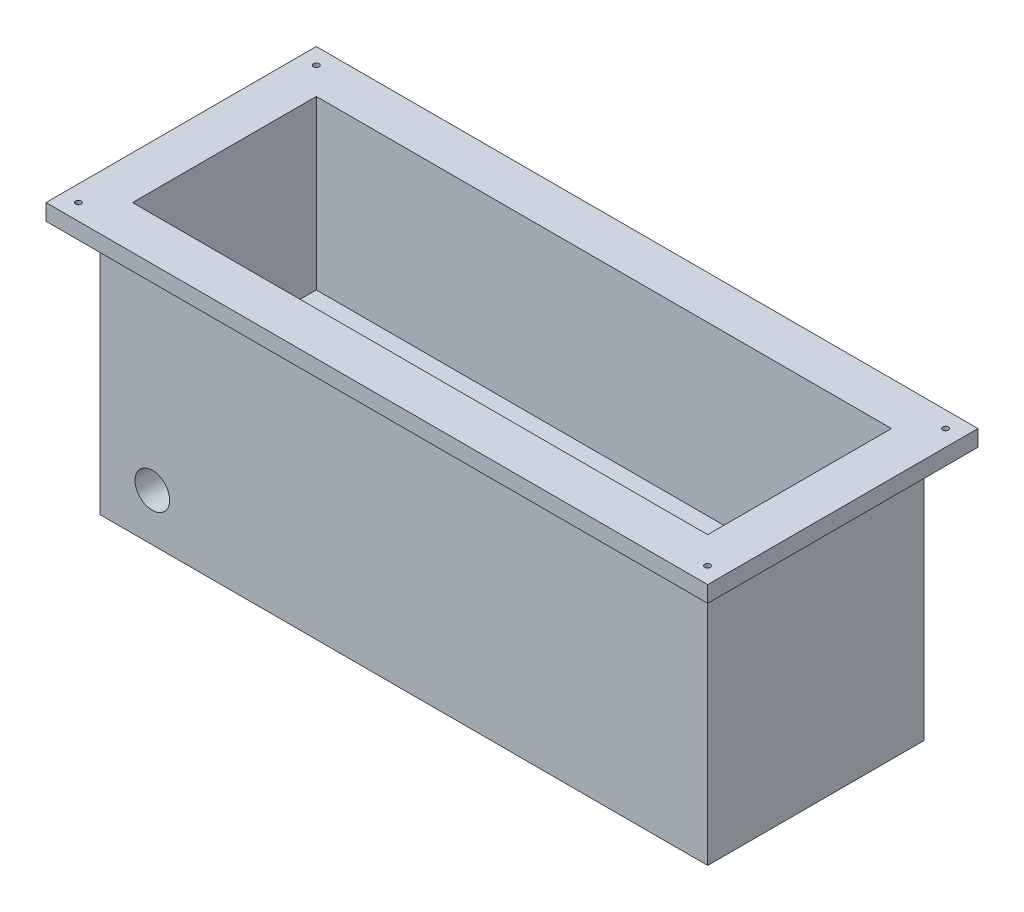
ISO-10303-21;
HEADER;
FILE_DESCRIPTION(('STEP AP214'),'2;1');
FILE_NAME('part.step','',(''),(''),'','','');
FILE_SCHEMA(('AUTOMOTIVE_DESIGN { 1 0 10303 214 1 1 1 1 }'));
ENDSEC;
DATA;
#1=APPLICATION_CONTEXT('core data for automotive mechanical design processes');
#2=APPLICATION_PROTOCOL_DEFINITION('international standard','automotive_design',2000,#1);
#3=PRODUCT_CONTEXT('',#1,'mechanical');
#4=PRODUCT('Part','Part','',(#3));
#5=PRODUCT_RELATED_PRODUCT_CATEGORY('part','',(#4));
#6=PRODUCT_DEFINITION_FORMATION('','',#4);
#7=PRODUCT_DEFINITION_CONTEXT('part definition',#1,'design');
#8=PRODUCT_DEFINITION('design','',#6,#7);
#9=PRODUCT_DEFINITION_SHAPE('','',#8);
#10=(LENGTH_UNIT() NAMED_UNIT(*) SI_UNIT(.MILLI.,.METRE.));
#11=(NAMED_UNIT(*) PLANE_ANGLE_UNIT() SI_UNIT($,.RADIAN.));
#12=(NAMED_UNIT(*) SI_UNIT($,.STERADIAN.) SOLID_ANGLE_UNIT());
#13=UNCERTAINTY_MEASURE_WITH_UNIT(LENGTH_MEASURE(1.E-05),#10,'distance_accuracy_value','');
#14=(GEOMETRIC_REPRESENTATION_CONTEXT(3) GLOBAL_UNCERTAINTY_ASSIGNED_CONTEXT((#13)) GLOBAL_UNIT_ASSIGNED_CONTEXT((#10,
#11,#12)) REPRESENTATION_CONTEXT('',''));
#15=CARTESIAN_POINT('',(0.,0.,0.));
#16=DIRECTION('',(0.,0.,1.));
#17=DIRECTION('',(1.,0.,0.));
#18=AXIS2_PLACEMENT_3D('',#15,#16,#17);
#19=CARTESIAN_POINT('',(0.,63.5,-3.81));
#20=DIRECTION('',(0.,0.,-1.));
#21=DIRECTION('',(-1.,0.,0.));
#22=AXIS2_PLACEMENT_3D('',#19,#20,#21);
#23=PLANE('',#22);
#24=DIRECTION('',(0.,-1.,0.));
#25=VECTOR('',#24,1.);
#26=CARTESIAN_POINT('',(138.938,63.5,-3.81));
#27=LINE('',#26,#25);
#28=CARTESIAN_POINT('',(138.938,63.5,-3.81));
#29=VERTEX_POINT('',#28);
#30=CARTESIAN_POINT('',(138.938,24.13,-3.81));
#31=VERTEX_POINT('',#30);
#32=EDGE_CURVE('E346',#29,#31,#27,.T.);
#33=ORIENTED_EDGE('',*,*,#32,.T.);
#34=DIRECTION('',(1.,0.,0.));
#35=VECTOR('',#34,1.);
#36=CARTESIAN_POINT('',(3.81,24.13,-3.81));
#37=LINE('',#36,#35);
#38=CARTESIAN_POINT('',(3.81,24.13,-3.81));
#39=VERTEX_POINT('',#38);
#40=EDGE_CURVE('E212',#39,#31,#37,.T.);
#41=ORIENTED_EDGE('',*,*,#40,.F.);
#42=DIRECTION('',(0.,-1.,0.));
#43=VECTOR('',#42,1.);
#44=CARTESIAN_POINT('',(3.81,63.5,-3.81));
#45=LINE('',#44,#43);
#46=CARTESIAN_POINT('',(3.81,63.5,-3.81));
#47=VERTEX_POINT('',#46);
#48=EDGE_CURVE('E352',#47,#39,#45,.T.);
#49=ORIENTED_EDGE('',*,*,#48,.F.);
#50=DIRECTION('',(1.,0.,0.));
#51=VECTOR('',#50,1.);
#52=CARTESIAN_POINT('',(0.,63.5,-3.81));
#53=LINE('',#52,#51);
#54=EDGE_CURVE('E368',#47,#29,#53,.T.);
#55=ORIENTED_EDGE('',*,*,#54,.T.);
#56=EDGE_LOOP('',(#33,#41,#49,#55));
#57=FACE_BOUND('',#56,.T.);
#58=ADVANCED_FACE('F45',(#57),#23,.T.);
#59=CARTESIAN_POINT('',(138.938,63.5,0.));
#60=DIRECTION('',(-1.,0.,0.));
#61=DIRECTION('',(0.,0.,1.));
#62=AXIS2_PLACEMENT_3D('',#59,#60,#61);
#63=PLANE('',#62);
#64=DIRECTION('',(0.,0.,-1.));
#65=VECTOR('',#64,1.);
#66=CARTESIAN_POINT('',(138.938,24.13,-46.99));
#67=LINE('',#66,#65);
#68=CARTESIAN_POINT('',(138.938,24.13,-40.386));
#69=VERTEX_POINT('',#68);
#70=CARTESIAN_POINT('',(138.938,24.13,-46.99));
#71=VERTEX_POINT('',#70);
#72=EDGE_CURVE('E168',#69,#71,#67,.T.);
#73=ORIENTED_EDGE('',*,*,#72,.F.);
#74=DIRECTION('',(0.,-1.,0.));
#75=VECTOR('',#74,1.);
#76=CARTESIAN_POINT('',(138.938,24.13,-40.386));
#77=LINE('',#76,#75);
#78=CARTESIAN_POINT('',(138.938,3.81,-40.386));
#79=VERTEX_POINT('',#78);
#80=EDGE_CURVE('E164',#69,#79,#77,.T.);
#81=ORIENTED_EDGE('',*,*,#80,.T.);
#82=DIRECTION('',(0.,0.,-1.));
#83=VECTOR('',#82,1.);
#84=CARTESIAN_POINT('',(138.938,3.81,0.));
#85=LINE('',#84,#83);
#86=CARTESIAN_POINT('',(138.938,3.81,-10.414));
#87=VERTEX_POINT('',#86);
#88=EDGE_CURVE('E345',#87,#79,#85,.T.);
#89=ORIENTED_EDGE('',*,*,#88,.F.);
#90=DIRECTION('',(0.,-1.,0.));
#91=VECTOR('',#90,1.);
#92=CARTESIAN_POINT('',(138.938,24.13,-10.414));
#93=LINE('',#92,#91);
#94=CARTESIAN_POINT('',(138.938,24.13,-10.414));
#95=VERTEX_POINT('',#94);
#96=EDGE_CURVE('E71',#95,#87,#93,.T.);
#97=ORIENTED_EDGE('',*,*,#96,.F.);
#98=DIRECTION('',(0.,0.,-1.));
#99=VECTOR('',#98,1.);
#100=CARTESIAN_POINT('',(138.938,24.13,-3.81));
#101=LINE('',#100,#99);
#102=EDGE_CURVE('E209',#31,#95,#101,.T.);
#103=ORIENTED_EDGE('',*,*,#102,.F.);
#104=ORIENTED_EDGE('',*,*,#32,.F.);
#105=DIRECTION('',(0.,0.,-1.));
#106=VECTOR('',#105,1.);
#107=CARTESIAN_POINT('',(138.938,63.5,0.));
#108=LINE('',#107,#106);
#109=CARTESIAN_POINT('',(138.938,63.5,-46.99));
#110=VERTEX_POINT('',#109);
#111=EDGE_CURVE('E371',#29,#110,#108,.T.);
#112=ORIENTED_EDGE('',*,*,#111,.T.);
#113=DIRECTION('',(0.,-1.,0.));
#114=VECTOR('',#113,1.);
#115=CARTESIAN_POINT('',(138.938,63.5,-46.99));
#116=LINE('',#115,#114);
#117=EDGE_CURVE('E351',#110,#71,#116,.T.);
#118=ORIENTED_EDGE('',*,*,#117,.T.);
#119=EDGE_LOOP('',(#73,#81,#89,#97,#103,#104,#112,#118));
#120=FACE_BOUND('',#119,.T.);
#121=ADVANCED_FACE('F452',(#120),#63,.T.);
#122=CARTESIAN_POINT('',(3.81,63.5,0.));
#123=DIRECTION('',(-1.,0.,0.));
#124=DIRECTION('',(0.,0.,1.));
#125=AXIS2_PLACEMENT_3D('',#122,#123,#124);
#126=PLANE('',#125);
#127=DIRECTION('',(0.,-1.,0.));
#128=VECTOR('',#127,1.);
#129=CARTESIAN_POINT('',(3.81,24.13,-40.386));
#130=LINE('',#129,#128);
#131=CARTESIAN_POINT('',(3.81,24.13,-40.386));
#132=VERTEX_POINT('',#131);
#133=CARTESIAN_POINT('',(3.81,3.81,-40.386));
#134=VERTEX_POINT('',#133);
#135=EDGE_CURVE('E63',#132,#134,#130,.T.);
#136=ORIENTED_EDGE('',*,*,#135,.F.);
#137=DIRECTION('',(0.,0.,1.));
#138=VECTOR('',#137,1.);
#139=CARTESIAN_POINT('',(3.81,24.13,-46.99));
#140=LINE('',#139,#138);
#141=CARTESIAN_POINT('',(3.81,24.13,-46.99));
#142=VERTEX_POINT('',#141);
#143=EDGE_CURVE('E169',#142,#132,#140,.T.);
#144=ORIENTED_EDGE('',*,*,#143,.F.);
#145=DIRECTION('',(0.,-1.,0.));
#146=VECTOR('',#145,1.);
#147=CARTESIAN_POINT('',(3.81,63.5,-46.99));
#148=LINE('',#147,#146);
#149=CARTESIAN_POINT('',(3.81,63.5,-46.99));
#150=VERTEX_POINT('',#149);
#151=EDGE_CURVE('E356',#150,#142,#148,.T.);
#152=ORIENTED_EDGE('',*,*,#151,.F.);
#153=DIRECTION('',(0.,0.,-1.));
#154=VECTOR('',#153,1.);
#155=CARTESIAN_POINT('',(3.81,63.5,0.));
#156=LINE('',#155,#154);
#157=EDGE_CURVE('E357',#47,#150,#156,.T.);
#158=ORIENTED_EDGE('',*,*,#157,.F.);
#159=ORIENTED_EDGE('',*,*,#48,.T.);
#160=DIRECTION('',(0.,0.,1.));
#161=VECTOR('',#160,1.);
#162=CARTESIAN_POINT('',(3.81,24.13,-3.81));
#163=LINE('',#162,#161);
#164=CARTESIAN_POINT('',(3.81,24.13,-10.414));
#165=VERTEX_POINT('',#164);
#166=EDGE_CURVE('E206',#165,#39,#163,.T.);
#167=ORIENTED_EDGE('',*,*,#166,.F.);
#168=DIRECTION('',(0.,-1.,0.));
#169=VECTOR('',#168,1.);
#170=CARTESIAN_POINT('',(3.81,24.13,-10.414));
#171=LINE('',#170,#169);
#172=CARTESIAN_POINT('',(3.81,3.81,-10.414));
#173=VERTEX_POINT('',#172);
#174=EDGE_CURVE('E199',#165,#173,#171,.T.);
#175=ORIENTED_EDGE('',*,*,#174,.T.);
#176=DIRECTION('',(0.,0.,-1.));
#177=VECTOR('',#176,1.);
#178=CARTESIAN_POINT('',(3.81,3.81,0.));
#179=LINE('',#178,#177);
#180=EDGE_CURVE('E185',#173,#134,#179,.T.);
#181=ORIENTED_EDGE('',*,*,#180,.T.);
#182=EDGE_LOOP('',(#136,#144,#152,#158,#159,#167,#175,#181));
#183=FACE_BOUND('',#182,.T.);
#184=ADVANCED_FACE('F182',(#183),#126,.F.);
#185=CARTESIAN_POINT('',(0.,3.81,0.));
#186=DIRECTION('',(0.,1.,0.));
#187=DIRECTION('',(0.,0.,1.));
#188=AXIS2_PLACEMENT_3D('',#185,#186,#187);
#189=PLANE('',#188);
#190=ORIENTED_EDGE('',*,*,#88,.T.);
#191=DIRECTION('',(1.,0.,0.));
#192=VECTOR('',#191,1.);
#193=CARTESIAN_POINT('',(3.81,3.81,-40.386));
#194=LINE('',#193,#192);
#195=EDGE_CURVE('E179',#134,#79,#194,.T.);
#196=ORIENTED_EDGE('',*,*,#195,.F.);
#197=ORIENTED_EDGE('',*,*,#180,.F.);
#198=DIRECTION('',(-1.,0.,0.));
#199=VECTOR('',#198,1.);
#200=CARTESIAN_POINT('',(3.81,3.81,-10.414));
#201=LINE('',#200,#199);
#202=EDGE_CURVE('E203',#87,#173,#201,.T.);
#203=ORIENTED_EDGE('',*,*,#202,.F.);
#204=EDGE_LOOP('',(#190,#196,#197,#203));
#205=FACE_BOUND('',#204,.T.);
#206=ADVANCED_FACE('F428',(#205),#189,.T.);
#207=CARTESIAN_POINT('',(-6.35,59.69,6.35));
#208=DIRECTION('',(0.,1.,0.));
#209=DIRECTION('',(0.,0.,1.));
#210=AXIS2_PLACEMENT_3D('',#207,#208,#209);
#211=PLANE('',#210);
#212=CARTESIAN_POINT('',(145.260013627776,59.69,2.54));
#213=DIRECTION('',(0.,-1.,0.));
#214=DIRECTION('',(0.,0.,-1.));
#215=AXIS2_PLACEMENT_3D('',#212,#213,#214);
#216=CIRCLE('',#215,2.22249999999999);
#217=CARTESIAN_POINT('',(145.260013627776,59.69,0.317500000000012));
#218=VERTEX_POINT('',#217);
#219=EDGE_CURVE('E232',#218,#218,#216,.T.);
#220=ORIENTED_EDGE('',*,*,#219,.F.);
#221=EDGE_LOOP('',(#220));
#222=FACE_BOUND('',#221,.T.);
#223=CARTESIAN_POINT('',(145.288,59.69,-53.34));
#224=DIRECTION('',(0.,-1.,0.));
#225=DIRECTION('',(0.,0.,-1.));
#226=AXIS2_PLACEMENT_3D('',#223,#224,#225);
#227=CIRCLE('',#226,2.22249999999999);
#228=CARTESIAN_POINT('',(145.288,59.69,-55.5625));
#229=VERTEX_POINT('',#228);
#230=EDGE_CURVE('E252',#229,#229,#227,.T.);
#231=ORIENTED_EDGE('',*,*,#230,.F.);
#232=EDGE_LOOP('',(#231));
#233=FACE_BOUND('',#232,.T.);
#234=CARTESIAN_POINT('',(-2.54,59.69,-53.34));
#235=DIRECTION('',(0.,-1.,0.));
#236=DIRECTION('',(0.,0.,-1.));
#237=AXIS2_PLACEMENT_3D('',#234,#235,#236);
#238=CIRCLE('',#237,2.2225);
#239=CARTESIAN_POINT('',(-2.54,59.69,-55.5625));
#240=VERTEX_POINT('',#239);
#241=EDGE_CURVE('E272',#240,#240,#238,.T.);
#242=ORIENTED_EDGE('',*,*,#241,.F.);
#243=EDGE_LOOP('',(#242));
#244=FACE_BOUND('',#243,.T.);
#245=DIRECTION('',(-1.,0.,0.));
#246=VECTOR('',#245,1.);
#247=CARTESIAN_POINT('',(149.098,59.69,-57.15));
#248=LINE('',#247,#246);
#249=CARTESIAN_POINT('',(149.098,59.69,-57.15));
#250=VERTEX_POINT('',#249);
#251=CARTESIAN_POINT('',(-6.35,59.69,-57.15));
#252=VERTEX_POINT('',#251);
#253=EDGE_CURVE('E302',#250,#252,#248,.T.);
#254=ORIENTED_EDGE('',*,*,#253,.F.);
#255=DIRECTION('',(0.,0.,-1.));
#256=VECTOR('',#255,1.);
#257=CARTESIAN_POINT('',(149.098,59.69,6.35));
#258=LINE('',#257,#256);
#259=CARTESIAN_POINT('',(149.098,59.69,6.35));
#260=VERTEX_POINT('',#259);
#261=EDGE_CURVE('E339',#260,#250,#258,.T.);
#262=ORIENTED_EDGE('',*,*,#261,.F.);
#263=DIRECTION('',(1.,0.,0.));
#264=VECTOR('',#263,1.);
#265=CARTESIAN_POINT('',(-6.35,59.69,6.35));
#266=LINE('',#265,#264);
#267=CARTESIAN_POINT('',(-6.35,59.69,6.35));
#268=VERTEX_POINT('',#267);
#269=EDGE_CURVE('E318',#268,#260,#266,.T.);
#270=ORIENTED_EDGE('',*,*,#269,.F.);
#271=DIRECTION('',(0.,0.,-1.));
#272=VECTOR('',#271,1.);
#273=CARTESIAN_POINT('',(-6.35,59.69,6.35));
#274=LINE('',#273,#272);
#275=EDGE_CURVE('E342',#268,#252,#274,.T.);
#276=ORIENTED_EDGE('',*,*,#275,.T.);
#277=EDGE_LOOP('',(#254,#262,#270,#276));
#278=FACE_BOUND('',#277,.T.);
#279=DIRECTION('',(1.,0.,0.));
#280=VECTOR('',#279,1.);
#281=CARTESIAN_POINT('',(-6.35,59.69,0.));
#282=LINE('',#281,#280);
#283=CARTESIAN_POINT('',(0.,59.69,0.));
#284=VERTEX_POINT('',#283);
#285=CARTESIAN_POINT('',(142.748,59.69,0.));
#286=VERTEX_POINT('',#285);
#287=EDGE_CURVE('E55',#284,#286,#282,.T.);
#288=ORIENTED_EDGE('',*,*,#287,.T.);
#289=DIRECTION('',(0.,0.,-1.));
#290=VECTOR('',#289,1.);
#291=CARTESIAN_POINT('',(142.748,59.69,0.));
#292=LINE('',#291,#290);
#293=CARTESIAN_POINT('',(142.748,59.69,-50.8));
#294=VERTEX_POINT('',#293);
#295=EDGE_CURVE('E292',#286,#294,#292,.T.);
#296=ORIENTED_EDGE('',*,*,#295,.T.);
#297=DIRECTION('',(-1.,0.,0.));
#298=VECTOR('',#297,1.);
#299=CARTESIAN_POINT('',(149.098,59.69,-50.8));
#300=LINE('',#299,#298);
#301=CARTESIAN_POINT('',(0.,59.69,-50.8));
#302=VERTEX_POINT('',#301);
#303=EDGE_CURVE('E11',#294,#302,#300,.T.);
#304=ORIENTED_EDGE('',*,*,#303,.T.);
#305=DIRECTION('',(0.,0.,1.));
#306=VECTOR('',#305,1.);
#307=CARTESIAN_POINT('',(0.,59.69,-50.8));
#308=LINE('',#307,#306);
#309=EDGE_CURVE('E295',#302,#284,#308,.T.);
#310=ORIENTED_EDGE('',*,*,#309,.T.);
#311=EDGE_LOOP('',(#288,#296,#304,#310));
#312=FACE_BOUND('',#311,.T.);
#313=CARTESIAN_POINT('',(-2.54,59.69,2.54));
#314=DIRECTION('',(0.,-1.,0.));
#315=DIRECTION('',(0.,0.,-1.));
#316=AXIS2_PLACEMENT_3D('',#313,#314,#315);
#317=CIRCLE('',#316,2.2225);
#318=CARTESIAN_POINT('',(-2.54,59.69,0.317500000000001));
#319=VERTEX_POINT('',#318);
#320=EDGE_CURVE('E187',#319,#319,#317,.T.);
#321=ORIENTED_EDGE('',*,*,#320,.F.);
#322=EDGE_LOOP('',(#321));
#323=FACE_BOUND('',#322,.T.);
#324=ADVANCED_FACE('F425',(#222,#233,#244,#278,#312,#323),#211,.F.);
#325=CARTESIAN_POINT('',(142.748,63.5,0.));
#326=DIRECTION('',(-1.,0.,0.));
#327=DIRECTION('',(0.,0.,1.));
#328=AXIS2_PLACEMENT_3D('',#325,#326,#327);
#329=PLANE('',#328);
#330=ORIENTED_EDGE('',*,*,#295,.F.);
#331=DIRECTION('',(0.,-1.,0.));
#332=VECTOR('',#331,1.);
#333=CARTESIAN_POINT('',(142.748,63.5,0.));
#334=LINE('',#333,#332);
#335=CARTESIAN_POINT('',(142.748,0.,0.));
#336=VERTEX_POINT('',#335);
#337=EDGE_CURVE('E333',#286,#336,#334,.T.);
#338=ORIENTED_EDGE('',*,*,#337,.T.);
#339=DIRECTION('',(0.,0.,-1.));
#340=VECTOR('',#339,1.);
#341=CARTESIAN_POINT('',(142.748,0.,0.));
#342=LINE('',#341,#340);
#343=CARTESIAN_POINT('',(142.748,0.,-50.8));
#344=VERTEX_POINT('',#343);
#345=EDGE_CURVE('E384',#336,#344,#342,.T.);
#346=ORIENTED_EDGE('',*,*,#345,.T.);
#347=DIRECTION('',(0.,-1.,0.));
#348=VECTOR('',#347,1.);
#349=CARTESIAN_POINT('',(142.748,63.5,-50.8));
#350=LINE('',#349,#348);
#351=EDGE_CURVE('E402',#294,#344,#350,.T.);
#352=ORIENTED_EDGE('',*,*,#351,.F.);
#353=EDGE_LOOP('',(#330,#338,#346,#352));
#354=FACE_BOUND('',#353,.T.);
#355=ADVANCED_FACE('F408',(#354),#329,.F.);
#356=CARTESIAN_POINT('',(0.,63.5,0.));
#357=DIRECTION('',(-1.,0.,0.));
#358=DIRECTION('',(0.,0.,1.));
#359=AXIS2_PLACEMENT_3D('',#356,#357,#358);
#360=PLANE('',#359);
#361=DIRECTION('',(0.,-1.,0.));
#362=VECTOR('',#361,1.);
#363=CARTESIAN_POINT('',(0.,63.5,0.));
#364=LINE('',#363,#362);
#365=CARTESIAN_POINT('',(0.,0.,0.));
#366=VERTEX_POINT('',#365);
#367=EDGE_CURVE('E396',#284,#366,#364,.T.);
#368=ORIENTED_EDGE('',*,*,#367,.F.);
#369=ORIENTED_EDGE('',*,*,#309,.F.);
#370=DIRECTION('',(0.,-1.,0.));
#371=VECTOR('',#370,1.);
#372=CARTESIAN_POINT('',(0.,63.5,-50.8));
#373=LINE('',#372,#371);
#374=CARTESIAN_POINT('',(0.,0.,-50.8));
#375=VERTEX_POINT('',#374);
#376=EDGE_CURVE('E399',#302,#375,#373,.T.);
#377=ORIENTED_EDGE('',*,*,#376,.T.);
#378=DIRECTION('',(0.,0.,-1.));
#379=VECTOR('',#378,1.);
#380=CARTESIAN_POINT('',(0.,0.,0.));
#381=LINE('',#380,#379);
#382=EDGE_CURVE('E392',#366,#375,#381,.T.);
#383=ORIENTED_EDGE('',*,*,#382,.F.);
#384=EDGE_LOOP('',(#368,#369,#377,#383));
#385=FACE_BOUND('',#384,.T.);
#386=ADVANCED_FACE('F419',(#385),#360,.T.);
#387=CARTESIAN_POINT('',(0.,63.5,0.));
#388=DIRECTION('',(0.,0.,-1.));
#389=DIRECTION('',(-1.,0.,0.));
#390=AXIS2_PLACEMENT_3D('',#387,#388,#389);
#391=PLANE('',#390);
#392=CARTESIAN_POINT('',(12.2804753557911,11.1077285654331,0.));
#393=DIRECTION('',(0.,0.,1.));
#394=DIRECTION('',(1.,0.,0.));
#395=AXIS2_PLACEMENT_3D('',#392,#393,#394);
#396=CIRCLE('',#395,4.07282304683041);
#397=CARTESIAN_POINT('',(16.3532984026215,11.1077285654331,0.));
#398=VERTEX_POINT('',#397);
#399=EDGE_CURVE('E718',#398,#398,#396,.T.);
#400=ORIENTED_EDGE('',*,*,#399,.F.);
#401=EDGE_LOOP('',(#400));
#402=FACE_BOUND('',#401,.T.);
#403=ORIENTED_EDGE('',*,*,#287,.F.);
#404=ORIENTED_EDGE('',*,*,#367,.T.);
#405=DIRECTION('',(1.,0.,0.));
#406=VECTOR('',#405,1.);
#407=CARTESIAN_POINT('',(0.,0.,0.));
#408=LINE('',#407,#406);
#409=EDGE_CURVE('E350',#366,#336,#408,.T.);
#410=ORIENTED_EDGE('',*,*,#409,.T.);
#411=ORIENTED_EDGE('',*,*,#337,.F.);
#412=EDGE_LOOP('',(#403,#404,#410,#411));
#413=FACE_BOUND('',#412,.T.);
#414=ADVANCED_FACE('F47',(#402,#413),#391,.F.);
#415=CARTESIAN_POINT('',(0.,63.5,-50.8));
#416=DIRECTION('',(0.,0.,-1.));
#417=DIRECTION('',(-1.,0.,0.));
#418=AXIS2_PLACEMENT_3D('',#415,#416,#417);
#419=PLANE('',#418);
#420=ORIENTED_EDGE('',*,*,#303,.F.);
#421=ORIENTED_EDGE('',*,*,#351,.T.);
#422=DIRECTION('',(1.,0.,0.));
#423=VECTOR('',#422,1.);
#424=CARTESIAN_POINT('',(0.,0.,-50.8));
#425=LINE('',#424,#423);
#426=EDGE_CURVE('E388',#375,#344,#425,.T.);
#427=ORIENTED_EDGE('',*,*,#426,.F.);
#428=ORIENTED_EDGE('',*,*,#376,.F.);
#429=EDGE_LOOP('',(#420,#421,#427,#428));
#430=FACE_BOUND('',#429,.T.);
#431=ADVANCED_FACE('F423',(#430),#419,.T.);
#432=CARTESIAN_POINT('',(0.,63.5,0.));
#433=DIRECTION('',(0.,1.,0.));
#434=DIRECTION('',(0.,0.,1.));
#435=AXIS2_PLACEMENT_3D('',#432,#433,#434);
#436=PLANE('',#435);
#437=CARTESIAN_POINT('',(-2.54,63.5,2.54));
#438=DIRECTION('',(0.,-1.,0.));
#439=DIRECTION('',(0.,0.,-1.));
#440=AXIS2_PLACEMENT_3D('',#437,#438,#439);
#441=CIRCLE('',#440,0.660399999999999);
#442=CARTESIAN_POINT('',(-2.54,63.5,1.8796));
#443=VERTEX_POINT('',#442);
#444=EDGE_CURVE('E228',#443,#443,#441,.T.);
#445=ORIENTED_EDGE('',*,*,#444,.T.);
#446=EDGE_LOOP('',(#445));
#447=FACE_BOUND('',#446,.T.);
#448=CARTESIAN_POINT('',(145.260013627776,63.5,2.54));
#449=DIRECTION('',(0.,-1.,0.));
#450=DIRECTION('',(0.,0.,-1.));
#451=AXIS2_PLACEMENT_3D('',#448,#449,#450);
#452=CIRCLE('',#451,0.660400000000005);
#453=CARTESIAN_POINT('',(145.260013627776,63.5,1.87959999999999));
#454=VERTEX_POINT('',#453);
#455=EDGE_CURVE('E248',#454,#454,#452,.T.);
#456=ORIENTED_EDGE('',*,*,#455,.T.);
#457=EDGE_LOOP('',(#456));
#458=FACE_BOUND('',#457,.T.);
#459=CARTESIAN_POINT('',(145.288,63.5,-53.34));
#460=DIRECTION('',(0.,-1.,0.));
#461=DIRECTION('',(0.,0.,-1.));
#462=AXIS2_PLACEMENT_3D('',#459,#460,#461);
#463=CIRCLE('',#462,0.660400000000005);
#464=CARTESIAN_POINT('',(145.288,63.5,-54.0004));
#465=VERTEX_POINT('',#464);
#466=EDGE_CURVE('E268',#465,#465,#463,.T.);
#467=ORIENTED_EDGE('',*,*,#466,.T.);
#468=EDGE_LOOP('',(#467));
#469=FACE_BOUND('',#468,.T.);
#470=CARTESIAN_POINT('',(-2.54,63.5,-53.34));
#471=DIRECTION('',(0.,-1.,0.));
#472=DIRECTION('',(0.,0.,-1.));
#473=AXIS2_PLACEMENT_3D('',#470,#471,#472);
#474=CIRCLE('',#473,0.660399999999999);
#475=CARTESIAN_POINT('',(-2.54,63.5,-54.0004));
#476=VERTEX_POINT('',#475);
#477=EDGE_CURVE('E288',#476,#476,#474,.T.);
#478=ORIENTED_EDGE('',*,*,#477,.T.);
#479=EDGE_LOOP('',(#478));
#480=FACE_BOUND('',#479,.T.);
#481=DIRECTION('',(0.,0.,-1.));
#482=VECTOR('',#481,1.);
#483=CARTESIAN_POINT('',(149.098,63.5,6.35));
#484=LINE('',#483,#482);
#485=CARTESIAN_POINT('',(149.098,63.5,6.35));
#486=VERTEX_POINT('',#485);
#487=CARTESIAN_POINT('',(149.098,63.5,-57.15));
#488=VERTEX_POINT('',#487);
#489=EDGE_CURVE('E336',#486,#488,#484,.T.);
#490=ORIENTED_EDGE('',*,*,#489,.T.);
#491=DIRECTION('',(1.,0.,0.));
#492=VECTOR('',#491,1.);
#493=CARTESIAN_POINT('',(149.098,63.5,-57.15));
#494=LINE('',#493,#492);
#495=CARTESIAN_POINT('',(-6.34999999999999,63.5,-57.15));
#496=VERTEX_POINT('',#495);
#497=EDGE_CURVE('E310',#496,#488,#494,.T.);
#498=ORIENTED_EDGE('',*,*,#497,.F.);
#499=DIRECTION('',(0.,0.,-1.));
#500=VECTOR('',#499,1.);
#501=CARTESIAN_POINT('',(-6.35,63.5,6.35));
#502=LINE('',#501,#500);
#503=CARTESIAN_POINT('',(-6.35,63.5,6.35));
#504=VERTEX_POINT('',#503);
#505=EDGE_CURVE('E329',#504,#496,#502,.T.);
#506=ORIENTED_EDGE('',*,*,#505,.F.);
#507=DIRECTION('',(1.,0.,0.));
#508=VECTOR('',#507,1.);
#509=CARTESIAN_POINT('',(-6.35,63.5,6.35));
#510=LINE('',#509,#508);
#511=EDGE_CURVE('E325',#504,#486,#510,.T.);
#512=ORIENTED_EDGE('',*,*,#511,.T.);
#513=EDGE_LOOP('',(#490,#498,#506,#512));
#514=FACE_BOUND('',#513,.T.);
#515=ORIENTED_EDGE('',*,*,#54,.F.);
#516=ORIENTED_EDGE('',*,*,#157,.T.);
#517=DIRECTION('',(1.,0.,0.));
#518=VECTOR('',#517,1.);
#519=CARTESIAN_POINT('',(0.,63.5,-46.99));
#520=LINE('',#519,#518);
#521=EDGE_CURVE('E374',#150,#110,#520,.T.);
#522=ORIENTED_EDGE('',*,*,#521,.T.);
#523=ORIENTED_EDGE('',*,*,#111,.F.);
#524=EDGE_LOOP('',(#515,#516,#522,#523));
#525=FACE_BOUND('',#524,.T.);
#526=ADVANCED_FACE('F472',(#447,#458,#469,#480,#514,#525),#436,.T.);
#527=CARTESIAN_POINT('',(0.,0.,0.));
#528=DIRECTION('',(0.,1.,0.));
#529=DIRECTION('',(0.,0.,1.));
#530=AXIS2_PLACEMENT_3D('',#527,#528,#529);
#531=PLANE('',#530);
#532=ORIENTED_EDGE('',*,*,#409,.F.);
#533=ORIENTED_EDGE('',*,*,#382,.T.);
#534=ORIENTED_EDGE('',*,*,#426,.T.);
#535=ORIENTED_EDGE('',*,*,#345,.F.);
#536=EDGE_LOOP('',(#532,#533,#534,#535));
#537=FACE_BOUND('',#536,.T.);
#538=ADVANCED_FACE('F414',(#537),#531,.F.);
#539=CARTESIAN_POINT('',(0.,63.5,-46.99));
#540=DIRECTION('',(0.,0.,-1.));
#541=DIRECTION('',(-1.,0.,0.));
#542=AXIS2_PLACEMENT_3D('',#539,#540,#541);
#543=PLANE('',#542);
#544=ORIENTED_EDGE('',*,*,#151,.T.);
#545=DIRECTION('',(-1.,0.,0.));
#546=VECTOR('',#545,1.);
#547=CARTESIAN_POINT('',(3.81,24.13,-46.99));
#548=LINE('',#547,#546);
#549=EDGE_CURVE('E174',#71,#142,#548,.T.);
#550=ORIENTED_EDGE('',*,*,#549,.F.);
#551=ORIENTED_EDGE('',*,*,#117,.F.);
#552=ORIENTED_EDGE('',*,*,#521,.F.);
#553=EDGE_LOOP('',(#544,#550,#551,#552));
#554=FACE_BOUND('',#553,.T.);
#555=ADVANCED_FACE('F463',(#554),#543,.F.);
#556=CARTESIAN_POINT('',(-6.35,63.5,6.35));
#557=DIRECTION('',(1.,0.,0.));
#558=DIRECTION('',(0.,1.,0.));
#559=AXIS2_PLACEMENT_3D('',#556,#557,#558);
#560=PLANE('',#559);
#561=ORIENTED_EDGE('',*,*,#505,.T.);
#562=DIRECTION('',(0.,1.,0.));
#563=VECTOR('',#562,1.);
#564=CARTESIAN_POINT('',(-6.34999999999999,63.5,-57.15));
#565=LINE('',#564,#563);
#566=EDGE_CURVE('E306',#252,#496,#565,.T.);
#567=ORIENTED_EDGE('',*,*,#566,.F.);
#568=ORIENTED_EDGE('',*,*,#275,.F.);
#569=DIRECTION('',(0.,-1.,0.));
#570=VECTOR('',#569,1.);
#571=CARTESIAN_POINT('',(-6.35,63.5,6.35));
#572=LINE('',#571,#570);
#573=EDGE_CURVE('E313',#504,#268,#572,.T.);
#574=ORIENTED_EDGE('',*,*,#573,.F.);
#575=EDGE_LOOP('',(#561,#567,#568,#574));
#576=FACE_BOUND('',#575,.T.);
#577=ADVANCED_FACE('F461',(#576),#560,.F.);
#578=CARTESIAN_POINT('',(149.098,63.5,6.35));
#579=DIRECTION('',(1.,0.,0.));
#580=DIRECTION('',(0.,0.,-1.));
#581=AXIS2_PLACEMENT_3D('',#578,#579,#580);
#582=PLANE('',#581);
#583=ORIENTED_EDGE('',*,*,#261,.T.);
#584=DIRECTION('',(0.,-1.,0.));
#585=VECTOR('',#584,1.);
#586=CARTESIAN_POINT('',(149.098,63.5,-57.15));
#587=LINE('',#586,#585);
#588=EDGE_CURVE('E298',#488,#250,#587,.T.);
#589=ORIENTED_EDGE('',*,*,#588,.F.);
#590=ORIENTED_EDGE('',*,*,#489,.F.);
#591=DIRECTION('',(0.,-1.,0.));
#592=VECTOR('',#591,1.);
#593=CARTESIAN_POINT('',(149.098,63.5,6.35));
#594=LINE('',#593,#592);
#595=EDGE_CURVE('E321',#486,#260,#594,.T.);
#596=ORIENTED_EDGE('',*,*,#595,.T.);
#597=EDGE_LOOP('',(#583,#589,#590,#596));
#598=FACE_BOUND('',#597,.T.);
#599=ADVANCED_FACE('F498',(#598),#582,.T.);
#600=CARTESIAN_POINT('',(0.,0.,6.35));
#601=DIRECTION('',(0.,0.,1.));
#602=DIRECTION('',(1.,0.,0.));
#603=AXIS2_PLACEMENT_3D('',#600,#601,#602);
#604=PLANE('',#603);
#605=ORIENTED_EDGE('',*,*,#573,.T.);
#606=ORIENTED_EDGE('',*,*,#269,.T.);
#607=ORIENTED_EDGE('',*,*,#595,.F.);
#608=ORIENTED_EDGE('',*,*,#511,.F.);
#609=EDGE_LOOP('',(#605,#606,#607,#608));
#610=FACE_BOUND('',#609,.T.);
#611=ADVANCED_FACE('F501',(#610),#604,.T.);
#612=CARTESIAN_POINT('',(0.,0.,-57.15));
#613=DIRECTION('',(0.,0.,-1.));
#614=DIRECTION('',(-1.,0.,0.));
#615=AXIS2_PLACEMENT_3D('',#612,#613,#614);
#616=PLANE('',#615);
#617=ORIENTED_EDGE('',*,*,#588,.T.);
#618=ORIENTED_EDGE('',*,*,#253,.T.);
#619=ORIENTED_EDGE('',*,*,#566,.T.);
#620=ORIENTED_EDGE('',*,*,#497,.T.);
#621=EDGE_LOOP('',(#617,#618,#619,#620));
#622=FACE_BOUND('',#621,.T.);
#623=ADVANCED_FACE('F523',(#622),#616,.T.);
#624=CARTESIAN_POINT('',(-2.54,59.69,-53.34));
#625=DIRECTION('',(0.,-1.,0.));
#626=DIRECTION('',(0.,0.,-1.));
#627=AXIS2_PLACEMENT_3D('',#624,#625,#626);
#628=CYLINDRICAL_SURFACE('',#627,0.660400000000007);
#629=ORIENTED_EDGE('',*,*,#477,.F.);
#630=EDGE_LOOP('',(#629));
#631=FACE_BOUND('',#630,.T.);
#632=CARTESIAN_POINT('',(-2.54,60.4012,-53.34));
#633=DIRECTION('',(0.,-1.,0.));
#634=DIRECTION('',(0.,0.,-1.));
#635=AXIS2_PLACEMENT_3D('',#632,#633,#634);
#636=CIRCLE('',#635,0.660400000000016);
#637=CARTESIAN_POINT('',(-2.54,60.4012,-54.0004));
#638=VERTEX_POINT('',#637);
#639=EDGE_CURVE('E284',#638,#638,#636,.T.);
#640=ORIENTED_EDGE('',*,*,#639,.T.);
#641=EDGE_LOOP('',(#640));
#642=FACE_BOUND('',#641,.T.);
#643=ADVANCED_FACE('F518',(#631,#642),#628,.F.);
#644=CARTESIAN_POINT('',(-0.9525,60.4012,-53.34));
#645=DIRECTION('',(0.,1.,0.));
#646=DIRECTION('',(0.,0.,1.));
#647=AXIS2_PLACEMENT_3D('',#644,#645,#646);
#648=PLANE('',#647);
#649=ORIENTED_EDGE('',*,*,#639,.F.);
#650=EDGE_LOOP('',(#649));
#651=FACE_BOUND('',#650,.T.);
#652=CARTESIAN_POINT('',(-2.54,60.4012,-53.34));
#653=DIRECTION('',(0.,-1.,0.));
#654=DIRECTION('',(0.,0.,-1.));
#655=AXIS2_PLACEMENT_3D('',#652,#653,#654);
#656=CIRCLE('',#655,1.5875);
#657=CARTESIAN_POINT('',(-2.54,60.4012,-54.9275));
#658=VERTEX_POINT('',#657);
#659=EDGE_CURVE('E280',#658,#658,#656,.T.);
#660=ORIENTED_EDGE('',*,*,#659,.T.);
#661=EDGE_LOOP('',(#660));
#662=FACE_BOUND('',#661,.T.);
#663=ADVANCED_FACE('F522',(#651,#662),#648,.F.);
#664=CARTESIAN_POINT('',(-2.54,59.69,-53.34));
#665=DIRECTION('',(0.,-1.,0.));
#666=DIRECTION('',(0.,0.,-1.));
#667=AXIS2_PLACEMENT_3D('',#664,#665,#666);
#668=CYLINDRICAL_SURFACE('',#667,1.5875);
#669=ORIENTED_EDGE('',*,*,#659,.F.);
#670=EDGE_LOOP('',(#669));
#671=FACE_BOUND('',#670,.T.);
#672=CARTESIAN_POINT('',(-2.54,60.2228282657976,-53.34));
#673=DIRECTION('',(0.,-1.,0.));
#674=DIRECTION('',(0.,0.,-1.));
#675=AXIS2_PLACEMENT_3D('',#672,#673,#674);
#676=CIRCLE('',#675,1.5875);
#677=CARTESIAN_POINT('',(-2.54,60.2228282657976,-54.9275));
#678=VERTEX_POINT('',#677);
#679=EDGE_CURVE('E276',#678,#678,#676,.T.);
#680=ORIENTED_EDGE('',*,*,#679,.T.);
#681=EDGE_LOOP('',(#680));
#682=FACE_BOUND('',#681,.T.);
#683=ADVANCED_FACE('F531',(#671,#682),#668,.F.);
#684=CARTESIAN_POINT('',(-2.54,59.69,-53.34));
#685=DIRECTION('',(0.,-1.,0.));
#686=DIRECTION('',(0.,0.,-1.));
#687=AXIS2_PLACEMENT_3D('',#684,#685,#686);
#688=CONICAL_SURFACE('',#687,2.2225,0.872664625997163);
#689=ORIENTED_EDGE('',*,*,#679,.F.);
#690=EDGE_LOOP('',(#689));
#691=FACE_BOUND('',#690,.T.);
#692=ORIENTED_EDGE('',*,*,#241,.T.);
#693=EDGE_LOOP('',(#692));
#694=FACE_BOUND('',#693,.T.);
#695=ADVANCED_FACE('F540',(#691,#694),#688,.F.);
#696=CARTESIAN_POINT('',(145.288,59.69,-53.34));
#697=DIRECTION('',(0.,-1.,0.));
#698=DIRECTION('',(0.,0.,-1.));
#699=AXIS2_PLACEMENT_3D('',#696,#697,#698);
#700=CYLINDRICAL_SURFACE('',#699,0.660400000000005);
#701=ORIENTED_EDGE('',*,*,#466,.F.);
#702=EDGE_LOOP('',(#701));
#703=FACE_BOUND('',#702,.T.);
#704=CARTESIAN_POINT('',(145.288,60.4012,-53.34));
#705=DIRECTION('',(0.,-1.,0.));
#706=DIRECTION('',(0.,0.,-1.));
#707=AXIS2_PLACEMENT_3D('',#704,#705,#706);
#708=CIRCLE('',#707,0.660400000000005);
#709=CARTESIAN_POINT('',(145.288,60.4012,-54.0004));
#710=VERTEX_POINT('',#709);
#711=EDGE_CURVE('E264',#710,#710,#708,.T.);
#712=ORIENTED_EDGE('',*,*,#711,.T.);
#713=EDGE_LOOP('',(#712));
#714=FACE_BOUND('',#713,.T.);
#715=ADVANCED_FACE('F549',(#703,#714),#700,.F.);
#716=CARTESIAN_POINT('',(146.8755,60.4012,-53.34));
#717=DIRECTION('',(0.,1.,0.));
#718=DIRECTION('',(0.,0.,1.));
#719=AXIS2_PLACEMENT_3D('',#716,#717,#718);
#720=PLANE('',#719);
#721=ORIENTED_EDGE('',*,*,#711,.F.);
#722=EDGE_LOOP('',(#721));
#723=FACE_BOUND('',#722,.T.);
#724=CARTESIAN_POINT('',(145.288,60.4012,-53.34));
#725=DIRECTION('',(0.,-1.,0.));
#726=DIRECTION('',(0.,0.,-1.));
#727=AXIS2_PLACEMENT_3D('',#724,#725,#726);
#728=CIRCLE('',#727,1.58749999999999);
#729=CARTESIAN_POINT('',(145.288,60.4012,-54.9275));
#730=VERTEX_POINT('',#729);
#731=EDGE_CURVE('E260',#730,#730,#728,.T.);
#732=ORIENTED_EDGE('',*,*,#731,.T.);
#733=EDGE_LOOP('',(#732));
#734=FACE_BOUND('',#733,.T.);
#735=ADVANCED_FACE('F558',(#723,#734),#720,.F.);
#736=CARTESIAN_POINT('',(145.288,59.69,-53.34));
#737=DIRECTION('',(0.,-1.,0.));
#738=DIRECTION('',(0.,0.,-1.));
#739=AXIS2_PLACEMENT_3D('',#736,#737,#738);
#740=CYLINDRICAL_SURFACE('',#739,1.58749999999999);
#741=ORIENTED_EDGE('',*,*,#731,.F.);
#742=EDGE_LOOP('',(#741));
#743=FACE_BOUND('',#742,.T.);
#744=CARTESIAN_POINT('',(145.288,60.2228282657976,-53.34));
#745=DIRECTION('',(0.,-1.,0.));
#746=DIRECTION('',(0.,0.,-1.));
#747=AXIS2_PLACEMENT_3D('',#744,#745,#746);
#748=CIRCLE('',#747,1.58749999999999);
#749=CARTESIAN_POINT('',(145.288,60.2228282657976,-54.9275));
#750=VERTEX_POINT('',#749);
#751=EDGE_CURVE('E256',#750,#750,#748,.T.);
#752=ORIENTED_EDGE('',*,*,#751,.T.);
#753=EDGE_LOOP('',(#752));
#754=FACE_BOUND('',#753,.T.);
#755=ADVANCED_FACE('F567',(#743,#754),#740,.F.);
#756=CARTESIAN_POINT('',(145.288,59.69,-53.34));
#757=DIRECTION('',(0.,-1.,0.));
#758=DIRECTION('',(0.,0.,-1.));
#759=AXIS2_PLACEMENT_3D('',#756,#757,#758);
#760=CONICAL_SURFACE('',#759,2.22249999999999,0.872664625997158);
#761=ORIENTED_EDGE('',*,*,#751,.F.);
#762=EDGE_LOOP('',(#761));
#763=FACE_BOUND('',#762,.T.);
#764=ORIENTED_EDGE('',*,*,#230,.T.);
#765=EDGE_LOOP('',(#764));
#766=FACE_BOUND('',#765,.T.);
#767=ADVANCED_FACE('F576',(#763,#766),#760,.F.);
#768=CARTESIAN_POINT('',(145.260013627776,59.69,2.54));
#769=DIRECTION('',(0.,-1.,0.));
#770=DIRECTION('',(0.,0.,-1.));
#771=AXIS2_PLACEMENT_3D('',#768,#769,#770);
#772=CYLINDRICAL_SURFACE('',#771,0.660400000000005);
#773=ORIENTED_EDGE('',*,*,#455,.F.);
#774=EDGE_LOOP('',(#773));
#775=FACE_BOUND('',#774,.T.);
#776=CARTESIAN_POINT('',(145.260013627776,60.4012,2.54));
#777=DIRECTION('',(0.,-1.,0.));
#778=DIRECTION('',(0.,0.,-1.));
#779=AXIS2_PLACEMENT_3D('',#776,#777,#778);
#780=CIRCLE('',#779,0.660400000000005);
#781=CARTESIAN_POINT('',(145.260013627776,60.4012,1.87959999999999));
#782=VERTEX_POINT('',#781);
#783=EDGE_CURVE('E244',#782,#782,#780,.T.);
#784=ORIENTED_EDGE('',*,*,#783,.T.);
#785=EDGE_LOOP('',(#784));
#786=FACE_BOUND('',#785,.T.);
#787=ADVANCED_FACE('F585',(#775,#786),#772,.F.);
#788=CARTESIAN_POINT('',(146.847513627776,60.4012,2.54));
#789=DIRECTION('',(0.,1.,0.));
#790=DIRECTION('',(0.,0.,1.));
#791=AXIS2_PLACEMENT_3D('',#788,#789,#790);
#792=PLANE('',#791);
#793=ORIENTED_EDGE('',*,*,#783,.F.);
#794=EDGE_LOOP('',(#793));
#795=FACE_BOUND('',#794,.T.);
#796=CARTESIAN_POINT('',(145.260013627776,60.4012,2.54));
#797=DIRECTION('',(0.,-1.,0.));
#798=DIRECTION('',(0.,0.,-1.));
#799=AXIS2_PLACEMENT_3D('',#796,#797,#798);
#800=CIRCLE('',#799,1.58749999999999);
#801=CARTESIAN_POINT('',(145.260013627776,60.4012,0.952500000000008));
#802=VERTEX_POINT('',#801);
#803=EDGE_CURVE('E240',#802,#802,#800,.T.);
#804=ORIENTED_EDGE('',*,*,#803,.T.);
#805=EDGE_LOOP('',(#804));
#806=FACE_BOUND('',#805,.T.);
#807=ADVANCED_FACE('F594',(#795,#806),#792,.F.);
#808=CARTESIAN_POINT('',(145.260013627776,59.69,2.54));
#809=DIRECTION('',(0.,-1.,0.));
#810=DIRECTION('',(0.,0.,-1.));
#811=AXIS2_PLACEMENT_3D('',#808,#809,#810);
#812=CYLINDRICAL_SURFACE('',#811,1.58749999999999);
#813=ORIENTED_EDGE('',*,*,#803,.F.);
#814=EDGE_LOOP('',(#813));
#815=FACE_BOUND('',#814,.T.);
#816=CARTESIAN_POINT('',(145.260013627776,60.2228282657976,2.54));
#817=DIRECTION('',(0.,-1.,0.));
#818=DIRECTION('',(0.,0.,-1.));
#819=AXIS2_PLACEMENT_3D('',#816,#817,#818);
#820=CIRCLE('',#819,1.58749999999999);
#821=CARTESIAN_POINT('',(145.260013627776,60.2228282657976,0.952500000000008));
#822=VERTEX_POINT('',#821);
#823=EDGE_CURVE('E236',#822,#822,#820,.T.);
#824=ORIENTED_EDGE('',*,*,#823,.T.);
#825=EDGE_LOOP('',(#824));
#826=FACE_BOUND('',#825,.T.);
#827=ADVANCED_FACE('F603',(#815,#826),#812,.F.);
#828=CARTESIAN_POINT('',(145.260013627776,59.69,2.54));
#829=DIRECTION('',(0.,-1.,0.));
#830=DIRECTION('',(0.,0.,-1.));
#831=AXIS2_PLACEMENT_3D('',#828,#829,#830);
#832=CONICAL_SURFACE('',#831,2.22249999999999,0.872664625997158);
#833=ORIENTED_EDGE('',*,*,#823,.F.);
#834=EDGE_LOOP('',(#833));
#835=FACE_BOUND('',#834,.T.);
#836=ORIENTED_EDGE('',*,*,#219,.T.);
#837=EDGE_LOOP('',(#836));
#838=FACE_BOUND('',#837,.T.);
#839=ADVANCED_FACE('F612',(#835,#838),#832,.F.);
#840=CARTESIAN_POINT('',(-2.54,59.69,2.54));
#841=DIRECTION('',(0.,-1.,0.));
#842=DIRECTION('',(0.,0.,-1.));
#843=AXIS2_PLACEMENT_3D('',#840,#841,#842);
#844=CYLINDRICAL_SURFACE('',#843,0.660400000000007);
#845=ORIENTED_EDGE('',*,*,#444,.F.);
#846=EDGE_LOOP('',(#845));
#847=FACE_BOUND('',#846,.T.);
#848=CARTESIAN_POINT('',(-2.54,60.4012,2.54));
#849=DIRECTION('',(0.,-1.,0.));
#850=DIRECTION('',(0.,0.,-1.));
#851=AXIS2_PLACEMENT_3D('',#848,#849,#850);
#852=CIRCLE('',#851,0.660400000000016);
#853=CARTESIAN_POINT('',(-2.54,60.4012,1.87959999999998));
#854=VERTEX_POINT('',#853);
#855=EDGE_CURVE('E224',#854,#854,#852,.T.);
#856=ORIENTED_EDGE('',*,*,#855,.T.);
#857=EDGE_LOOP('',(#856));
#858=FACE_BOUND('',#857,.T.);
#859=ADVANCED_FACE('F621',(#847,#858),#844,.F.);
#860=CARTESIAN_POINT('',(-0.952500000000004,60.4012,2.54));
#861=DIRECTION('',(0.,1.,0.));
#862=DIRECTION('',(0.,0.,1.));
#863=AXIS2_PLACEMENT_3D('',#860,#861,#862);
#864=PLANE('',#863);
#865=ORIENTED_EDGE('',*,*,#855,.F.);
#866=EDGE_LOOP('',(#865));
#867=FACE_BOUND('',#866,.T.);
#868=CARTESIAN_POINT('',(-2.54,60.4012,2.54));
#869=DIRECTION('',(0.,-1.,0.));
#870=DIRECTION('',(0.,0.,-1.));
#871=AXIS2_PLACEMENT_3D('',#868,#869,#870);
#872=CIRCLE('',#871,1.5875);
#873=CARTESIAN_POINT('',(-2.54,60.4012,0.952500000000005));
#874=VERTEX_POINT('',#873);
#875=EDGE_CURVE('E220',#874,#874,#872,.T.);
#876=ORIENTED_EDGE('',*,*,#875,.T.);
#877=EDGE_LOOP('',(#876));
#878=FACE_BOUND('',#877,.T.);
#879=ADVANCED_FACE('F447',(#867,#878),#864,.F.);
#880=CARTESIAN_POINT('',(-2.54,59.69,2.54));
#881=DIRECTION('',(0.,-1.,0.));
#882=DIRECTION('',(0.,0.,-1.));
#883=AXIS2_PLACEMENT_3D('',#880,#881,#882);
#884=CYLINDRICAL_SURFACE('',#883,1.5875);
#885=ORIENTED_EDGE('',*,*,#875,.F.);
#886=EDGE_LOOP('',(#885));
#887=FACE_BOUND('',#886,.T.);
#888=CARTESIAN_POINT('',(-2.54,60.2228282657976,2.54));
#889=DIRECTION('',(0.,-1.,0.));
#890=DIRECTION('',(0.,0.,-1.));
#891=AXIS2_PLACEMENT_3D('',#888,#889,#890);
#892=CIRCLE('',#891,1.5875);
#893=CARTESIAN_POINT('',(-2.54,60.2228282657976,0.952500000000005));
#894=VERTEX_POINT('',#893);
#895=EDGE_CURVE('E192',#894,#894,#892,.T.);
#896=ORIENTED_EDGE('',*,*,#895,.T.);
#897=EDGE_LOOP('',(#896));
#898=FACE_BOUND('',#897,.T.);
#899=ADVANCED_FACE('F436',(#887,#898),#884,.F.);
#900=CARTESIAN_POINT('',(-2.54,59.69,2.54));
#901=DIRECTION('',(0.,-1.,0.));
#902=DIRECTION('',(0.,0.,-1.));
#903=AXIS2_PLACEMENT_3D('',#900,#901,#902);
#904=CONICAL_SURFACE('',#903,2.2225,0.872664625997163);
#905=ORIENTED_EDGE('',*,*,#895,.F.);
#906=EDGE_LOOP('',(#905));
#907=FACE_BOUND('',#906,.T.);
#908=ORIENTED_EDGE('',*,*,#320,.T.);
#909=EDGE_LOOP('',(#908));
#910=FACE_BOUND('',#909,.T.);
#911=ADVANCED_FACE('F433',(#907,#910),#904,.F.);
#912=CARTESIAN_POINT('',(3.81,24.13,-10.414));
#913=DIRECTION('',(0.,0.,1.));
#914=DIRECTION('',(1.,0.,0.));
#915=AXIS2_PLACEMENT_3D('',#912,#913,#914);
#916=PLANE('',#915);
#917=CARTESIAN_POINT('',(12.2804753557911,11.1077285654331,-10.414));
#918=DIRECTION('',(0.,0.,1.));
#919=DIRECTION('',(1.,0.,0.));
#920=AXIS2_PLACEMENT_3D('',#917,#918,#919);
#921=CIRCLE('',#920,4.07282304683041);
#922=CARTESIAN_POINT('',(16.3532984026215,11.1077285654331,-10.414));
#923=VERTEX_POINT('',#922);
#924=EDGE_CURVE('E49',#923,#923,#921,.T.);
#925=ORIENTED_EDGE('',*,*,#924,.T.);
#926=EDGE_LOOP('',(#925));
#927=FACE_BOUND('',#926,.T.);
#928=ORIENTED_EDGE('',*,*,#202,.T.);
#929=ORIENTED_EDGE('',*,*,#174,.F.);
#930=DIRECTION('',(-1.,0.,0.));
#931=VECTOR('',#930,1.);
#932=CARTESIAN_POINT('',(3.81,24.13,-10.414));
#933=LINE('',#932,#931);
#934=EDGE_CURVE('E202',#95,#165,#933,.T.);
#935=ORIENTED_EDGE('',*,*,#934,.F.);
#936=ORIENTED_EDGE('',*,*,#96,.T.);
#937=EDGE_LOOP('',(#928,#929,#935,#936));
#938=FACE_BOUND('',#937,.T.);
#939=ADVANCED_FACE('F435',(#927,#938),#916,.F.);
#940=CARTESIAN_POINT('',(0.,24.13,0.));
#941=DIRECTION('',(0.,-1.,0.));
#942=DIRECTION('',(0.,0.,-1.));
#943=AXIS2_PLACEMENT_3D('',#940,#941,#942);
#944=PLANE('',#943);
#945=ORIENTED_EDGE('',*,*,#166,.T.);
#946=ORIENTED_EDGE('',*,*,#40,.T.);
#947=ORIENTED_EDGE('',*,*,#102,.T.);
#948=ORIENTED_EDGE('',*,*,#934,.T.);
#949=EDGE_LOOP('',(#945,#946,#947,#948));
#950=FACE_BOUND('',#949,.T.);
#951=ADVANCED_FACE('F444',(#950),#944,.F.);
#952=CARTESIAN_POINT('',(3.81,24.13,-40.386));
#953=DIRECTION('',(0.,0.,-1.));
#954=DIRECTION('',(-1.,0.,0.));
#955=AXIS2_PLACEMENT_3D('',#952,#953,#954);
#956=PLANE('',#955);
#957=ORIENTED_EDGE('',*,*,#195,.T.);
#958=ORIENTED_EDGE('',*,*,#80,.F.);
#959=DIRECTION('',(1.,0.,0.));
#960=VECTOR('',#959,1.);
#961=CARTESIAN_POINT('',(3.81,24.13,-40.386));
#962=LINE('',#961,#960);
#963=EDGE_CURVE('E160',#132,#69,#962,.T.);
#964=ORIENTED_EDGE('',*,*,#963,.F.);
#965=ORIENTED_EDGE('',*,*,#135,.T.);
#966=EDGE_LOOP('',(#957,#958,#964,#965));
#967=FACE_BOUND('',#966,.T.);
#968=ADVANCED_FACE('F162',(#967),#956,.F.);
#969=CARTESIAN_POINT('',(0.,24.13,0.));
#970=DIRECTION('',(0.,1.,0.));
#971=DIRECTION('',(0.,0.,1.));
#972=AXIS2_PLACEMENT_3D('',#969,#970,#971);
#973=PLANE('',#972);
#974=ORIENTED_EDGE('',*,*,#143,.T.);
#975=ORIENTED_EDGE('',*,*,#963,.T.);
#976=ORIENTED_EDGE('',*,*,#72,.T.);
#977=ORIENTED_EDGE('',*,*,#549,.T.);
#978=EDGE_LOOP('',(#974,#975,#976,#977));
#979=FACE_BOUND('',#978,.T.);
#980=ADVANCED_FACE('F172',(#979),#973,.T.);
#981=CARTESIAN_POINT('',(12.2804753557911,11.1077285654331,-13.97));
#982=DIRECTION('',(0.,0.,1.));
#983=DIRECTION('',(1.,0.,0.));
#984=AXIS2_PLACEMENT_3D('',#981,#982,#983);
#985=CYLINDRICAL_SURFACE('',#984,4.07282304683041);
#986=ORIENTED_EDGE('',*,*,#399,.T.);
#987=EDGE_LOOP('',(#986));
#988=FACE_BOUND('',#987,.T.);
#989=ORIENTED_EDGE('',*,*,#924,.F.);
#990=EDGE_LOOP('',(#989));
#991=FACE_BOUND('',#990,.T.);
#992=ADVANCED_FACE('F704',(#988,#991),#985,.F.);
#993=CLOSED_SHELL('',(#58,#121,#184,#206,#324,#355,#386,#414,#431,#526,#538,#555,#577,#599,#611,
#623,#643,#663,#683,#695,#715,#735,#755,#767,#787,#807,#827,#839,#859,#879,#899,#911,#939,#951,
#968,#980,#992));
#994=MANIFOLD_SOLID_BREP('B2',#993);
#995=ADVANCED_BREP_SHAPE_REPRESENTATION('',(#18,#994),#14);
#996=SHAPE_DEFINITION_REPRESENTATION(#9,#995);
ENDSEC;
END-ISO-10303-21;
